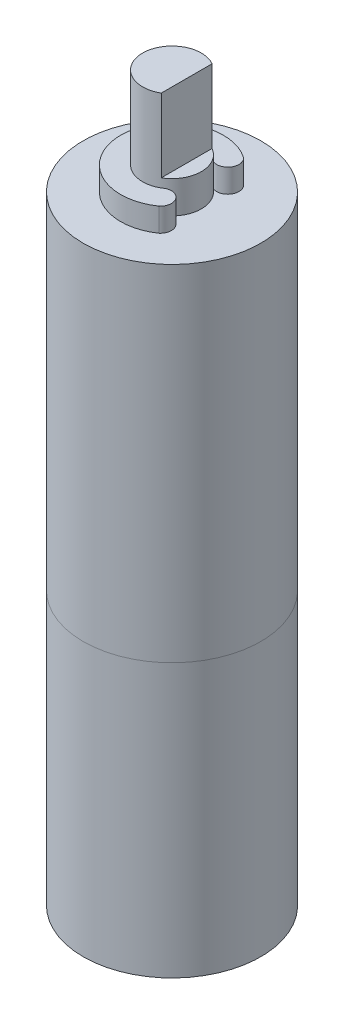
ISO-10303-21;
HEADER;
FILE_DESCRIPTION(('STEP AP214'),'2;1');
FILE_NAME('part.step','',(''),(''),'','','');
FILE_SCHEMA(('AUTOMOTIVE_DESIGN { 1 0 10303 214 1 1 1 1 }'));
ENDSEC;
DATA;
#1=APPLICATION_CONTEXT('core data for automotive mechanical design processes');
#2=APPLICATION_PROTOCOL_DEFINITION('international standard','automotive_design',2000,#1);
#3=PRODUCT_CONTEXT('',#1,'mechanical');
#4=PRODUCT('Part','Part','',(#3));
#5=PRODUCT_RELATED_PRODUCT_CATEGORY('part','',(#4));
#6=PRODUCT_DEFINITION_FORMATION('','',#4);
#7=PRODUCT_DEFINITION_CONTEXT('part definition',#1,'design');
#8=PRODUCT_DEFINITION('design','',#6,#7);
#9=PRODUCT_DEFINITION_SHAPE('','',#8);
#10=(LENGTH_UNIT() NAMED_UNIT(*) SI_UNIT(.MILLI.,.METRE.));
#11=(NAMED_UNIT(*) PLANE_ANGLE_UNIT() SI_UNIT($,.RADIAN.));
#12=(NAMED_UNIT(*) SI_UNIT($,.STERADIAN.) SOLID_ANGLE_UNIT());
#13=UNCERTAINTY_MEASURE_WITH_UNIT(LENGTH_MEASURE(1.E-05),#10,'distance_accuracy_value','');
#14=(GEOMETRIC_REPRESENTATION_CONTEXT(3) GLOBAL_UNCERTAINTY_ASSIGNED_CONTEXT((#13)) GLOBAL_UNIT_ASSIGNED_CONTEXT((#10,
#11,#12)) REPRESENTATION_CONTEXT('',''));
#15=CARTESIAN_POINT('',(0.,0.,0.));
#16=DIRECTION('',(0.,0.,1.));
#17=DIRECTION('',(1.,0.,0.));
#18=AXIS2_PLACEMENT_3D('',#15,#16,#17);
#19=CARTESIAN_POINT('',(0.,21.05,0.));
#20=DIRECTION('',(0.,1.,0.));
#21=DIRECTION('',(0.,0.,1.));
#22=AXIS2_PLACEMENT_3D('',#19,#20,#21);
#23=PLANE('',#22);
#24=CARTESIAN_POINT('',(0.,21.05,0.));
#25=DIRECTION('',(0.,1.,0.));
#26=DIRECTION('',(0.,0.,1.));
#27=AXIS2_PLACEMENT_3D('',#24,#25,#26);
#28=CIRCLE('',#27,3.025);
#29=CARTESIAN_POINT('',(0.,21.05,3.025));
#30=VERTEX_POINT('',#29);
#31=EDGE_CURVE('E12',#30,#30,#28,.T.);
#32=ORIENTED_EDGE('',*,*,#31,.T.);
#33=EDGE_LOOP('',(#32));
#34=FACE_BOUND('',#33,.T.);
#35=CARTESIAN_POINT('',(0.750070640038731,21.05,-1.15103384014043));
#36=DIRECTION('',(0.,1.,0.));
#37=DIRECTION('',(0.,0.,1.));
#38=AXIS2_PLACEMENT_3D('',#35,#36,#37);
#39=CIRCLE('',#38,0.37916372954631);
#40=CARTESIAN_POINT('',(1.00014128007746,21.05,-1.43604227649642));
#41=VERTEX_POINT('',#40);
#42=CARTESIAN_POINT('',(0.590331187613706,21.05,-0.807161129472048));
#43=VERTEX_POINT('',#42);
#44=EDGE_CURVE('E133',#41,#43,#39,.F.);
#45=ORIENTED_EDGE('',*,*,#44,.T.);
#46=CARTESIAN_POINT('',(0.,21.05,0.));
#47=DIRECTION('',(0.,1.,0.));
#48=DIRECTION('',(0.,0.,1.));
#49=AXIS2_PLACEMENT_3D('',#46,#47,#48);
#50=CIRCLE('',#49,1.);
#51=CARTESIAN_POINT('',(0.590331187613706,21.05,0.807161129472048));
#52=VERTEX_POINT('',#51);
#53=EDGE_CURVE('E123',#52,#43,#50,.T.);
#54=ORIENTED_EDGE('',*,*,#53,.F.);
#55=CARTESIAN_POINT('',(0.750070640038731,21.05,1.15103384014043));
#56=DIRECTION('',(0.,1.,0.));
#57=DIRECTION('',(0.,0.,1.));
#58=AXIS2_PLACEMENT_3D('',#55,#56,#57);
#59=CIRCLE('',#58,0.37916372954631);
#60=CARTESIAN_POINT('',(1.00014128007746,21.05,1.43604227649642));
#61=VERTEX_POINT('',#60);
#62=EDGE_CURVE('E144',#61,#52,#59,.T.);
#63=ORIENTED_EDGE('',*,*,#62,.F.);
#64=CARTESIAN_POINT('',(0.,21.05,0.));
#65=DIRECTION('',(0.,1.,0.));
#66=DIRECTION('',(0.,0.,1.));
#67=AXIS2_PLACEMENT_3D('',#64,#65,#66);
#68=CIRCLE('',#67,1.75);
#69=EDGE_CURVE('E136',#41,#61,#68,.T.);
#70=ORIENTED_EDGE('',*,*,#69,.F.);
#71=EDGE_LOOP('',(#45,#54,#63,#70));
#72=FACE_BOUND('',#71,.T.);
#73=ADVANCED_FACE('F53',(#34,#72),#23,.T.);
#74=CARTESIAN_POINT('',(0.,21.05,0.));
#75=DIRECTION('',(0.,-1.,0.));
#76=DIRECTION('',(0.,0.,-1.));
#77=AXIS2_PLACEMENT_3D('',#74,#75,#76);
#78=CYLINDRICAL_SURFACE('',#77,3.025);
#79=ORIENTED_EDGE('',*,*,#31,.F.);
#80=EDGE_LOOP('',(#79));
#81=FACE_BOUND('',#80,.T.);
#82=CARTESIAN_POINT('',(0.,9.3,0.));
#83=DIRECTION('',(0.,1.,0.));
#84=DIRECTION('',(0.,0.,1.));
#85=AXIS2_PLACEMENT_3D('',#82,#83,#84);
#86=CIRCLE('',#85,3.025);
#87=CARTESIAN_POINT('',(0.,9.3,3.025));
#88=VERTEX_POINT('',#87);
#89=EDGE_CURVE('E57',#88,#88,#86,.T.);
#90=ORIENTED_EDGE('',*,*,#89,.T.);
#91=EDGE_LOOP('',(#90));
#92=FACE_BOUND('',#91,.T.);
#93=ADVANCED_FACE('F55',(#81,#92),#78,.T.);
#94=CARTESIAN_POINT('',(0.,9.3,0.));
#95=DIRECTION('',(0.,1.,0.));
#96=DIRECTION('',(0.,0.,1.));
#97=AXIS2_PLACEMENT_3D('',#94,#95,#96);
#98=PLANE('',#97);
#99=ORIENTED_EDGE('',*,*,#89,.F.);
#100=EDGE_LOOP('',(#99));
#101=FACE_BOUND('',#100,.T.);
#102=ADVANCED_FACE('F163',(#101),#98,.F.);
#103=CARTESIAN_POINT('',(0.750070640038731,21.85,-1.15103384014043));
#104=DIRECTION('',(0.,-1.,0.));
#105=DIRECTION('',(0.,0.,-1.));
#106=AXIS2_PLACEMENT_3D('',#103,#104,#105);
#107=CYLINDRICAL_SURFACE('',#106,0.37916372954631);
#108=ORIENTED_EDGE('',*,*,#44,.F.);
#109=DIRECTION('',(0.,-1.,0.));
#110=VECTOR('',#109,1.);
#111=CARTESIAN_POINT('',(1.00014128007746,21.85,-1.43604227649642));
#112=LINE('',#111,#110);
#113=CARTESIAN_POINT('',(1.00014128007746,21.85,-1.43604227649642));
#114=VERTEX_POINT('',#113);
#115=EDGE_CURVE('E85',#114,#41,#112,.T.);
#116=ORIENTED_EDGE('',*,*,#115,.F.);
#117=CARTESIAN_POINT('',(0.750070640038731,21.85,-1.15103384014043));
#118=DIRECTION('',(0.,1.,0.));
#119=DIRECTION('',(0.,0.,1.));
#120=AXIS2_PLACEMENT_3D('',#117,#118,#119);
#121=CIRCLE('',#120,0.37916372954631);
#122=CARTESIAN_POINT('',(0.590331187613705,21.85,-0.807161129472048));
#123=VERTEX_POINT('',#122);
#124=EDGE_CURVE('E143',#114,#123,#121,.F.);
#125=ORIENTED_EDGE('',*,*,#124,.T.);
#126=DIRECTION('',(0.,-1.,0.));
#127=VECTOR('',#126,1.);
#128=CARTESIAN_POINT('',(0.590331187613705,21.85,-0.807161129472048));
#129=LINE('',#128,#127);
#130=EDGE_CURVE('E156',#123,#43,#129,.T.);
#131=ORIENTED_EDGE('',*,*,#130,.T.);
#132=EDGE_LOOP('',(#108,#116,#125,#131));
#133=FACE_BOUND('',#132,.T.);
#134=ADVANCED_FACE('F165',(#133),#107,.T.);
#135=CARTESIAN_POINT('',(0.,21.85,0.));
#136=DIRECTION('',(0.,-1.,0.));
#137=DIRECTION('',(0.,0.,-1.));
#138=AXIS2_PLACEMENT_3D('',#135,#136,#137);
#139=CYLINDRICAL_SURFACE('',#138,1.75);
#140=ORIENTED_EDGE('',*,*,#69,.T.);
#141=DIRECTION('',(0.,-1.,0.));
#142=VECTOR('',#141,1.);
#143=CARTESIAN_POINT('',(1.00014128007746,21.85,1.43604227649642));
#144=LINE('',#143,#142);
#145=CARTESIAN_POINT('',(1.00014128007746,21.85,1.43604227649642));
#146=VERTEX_POINT('',#145);
#147=EDGE_CURVE('E68',#146,#61,#144,.T.);
#148=ORIENTED_EDGE('',*,*,#147,.F.);
#149=CARTESIAN_POINT('',(0.,21.85,0.));
#150=DIRECTION('',(0.,1.,0.));
#151=DIRECTION('',(0.,0.,1.));
#152=AXIS2_PLACEMENT_3D('',#149,#150,#151);
#153=CIRCLE('',#152,1.75);
#154=EDGE_CURVE('E77',#114,#146,#153,.T.);
#155=ORIENTED_EDGE('',*,*,#154,.F.);
#156=ORIENTED_EDGE('',*,*,#115,.T.);
#157=EDGE_LOOP('',(#140,#148,#155,#156));
#158=FACE_BOUND('',#157,.T.);
#159=ADVANCED_FACE('F170',(#158),#139,.T.);
#160=CARTESIAN_POINT('',(0.750070640038731,21.85,1.15103384014043));
#161=DIRECTION('',(0.,-1.,0.));
#162=DIRECTION('',(0.,0.,-1.));
#163=AXIS2_PLACEMENT_3D('',#160,#161,#162);
#164=CYLINDRICAL_SURFACE('',#163,0.37916372954631);
#165=ORIENTED_EDGE('',*,*,#62,.T.);
#166=DIRECTION('',(0.,-1.,0.));
#167=VECTOR('',#166,1.);
#168=CARTESIAN_POINT('',(0.590331187613706,21.85,0.807161129472048));
#169=LINE('',#168,#167);
#170=CARTESIAN_POINT('',(0.590331187613707,21.85,0.807161129472047));
#171=VERTEX_POINT('',#170);
#172=EDGE_CURVE('E149',#171,#52,#169,.T.);
#173=ORIENTED_EDGE('',*,*,#172,.F.);
#174=CARTESIAN_POINT('',(0.750070640038731,21.85,1.15103384014043));
#175=DIRECTION('',(0.,1.,0.));
#176=DIRECTION('',(0.,0.,1.));
#177=AXIS2_PLACEMENT_3D('',#174,#175,#176);
#178=CIRCLE('',#177,0.37916372954631);
#179=EDGE_CURVE('E148',#146,#171,#178,.T.);
#180=ORIENTED_EDGE('',*,*,#179,.F.);
#181=ORIENTED_EDGE('',*,*,#147,.T.);
#182=EDGE_LOOP('',(#165,#173,#180,#181));
#183=FACE_BOUND('',#182,.T.);
#184=ADVANCED_FACE('F182',(#183),#164,.T.);
#185=CARTESIAN_POINT('',(0.,21.85,0.));
#186=DIRECTION('',(0.,1.,0.));
#187=DIRECTION('',(0.,0.,1.));
#188=AXIS2_PLACEMENT_3D('',#185,#186,#187);
#189=PLANE('',#188);
#190=CARTESIAN_POINT('',(0.,21.85,0.));
#191=DIRECTION('',(0.,1.,0.));
#192=DIRECTION('',(0.,0.,1.));
#193=AXIS2_PLACEMENT_3D('',#190,#191,#192);
#194=CIRCLE('',#193,1.);
#195=EDGE_CURVE('E141',#123,#171,#194,.T.);
#196=ORIENTED_EDGE('',*,*,#195,.F.);
#197=ORIENTED_EDGE('',*,*,#124,.F.);
#198=ORIENTED_EDGE('',*,*,#154,.T.);
#199=ORIENTED_EDGE('',*,*,#179,.T.);
#200=EDGE_LOOP('',(#196,#197,#198,#199));
#201=FACE_BOUND('',#200,.T.);
#202=ADVANCED_FACE('F185',(#201),#189,.T.);
#203=CARTESIAN_POINT('',(0.5,24.65,0.));
#204=DIRECTION('',(1.,0.,0.));
#205=DIRECTION('',(0.,0.,-1.));
#206=AXIS2_PLACEMENT_3D('',#203,#204,#205);
#207=PLANE('',#206);
#208=DIRECTION('',(0.,0.,1.));
#209=VECTOR('',#208,1.);
#210=CARTESIAN_POINT('',(0.5,22.15,0.));
#211=LINE('',#210,#209);
#212=CARTESIAN_POINT('',(0.5,22.15,-0.866025403784439));
#213=VERTEX_POINT('',#212);
#214=CARTESIAN_POINT('',(0.5,22.15,0.866025403784439));
#215=VERTEX_POINT('',#214);
#216=EDGE_CURVE('E119',#213,#215,#211,.T.);
#217=ORIENTED_EDGE('',*,*,#216,.F.);
#218=DIRECTION('',(0.,-1.,0.));
#219=VECTOR('',#218,1.);
#220=CARTESIAN_POINT('',(0.5,24.65,-0.866025403784439));
#221=LINE('',#220,#219);
#222=CARTESIAN_POINT('',(0.5,24.65,-0.866025403784439));
#223=VERTEX_POINT('',#222);
#224=EDGE_CURVE('E128',#223,#213,#221,.T.);
#225=ORIENTED_EDGE('',*,*,#224,.F.);
#226=DIRECTION('',(0.,0.,1.));
#227=VECTOR('',#226,1.);
#228=CARTESIAN_POINT('',(0.5,24.65,0.));
#229=LINE('',#228,#227);
#230=CARTESIAN_POINT('',(0.5,24.65,0.866025403784439));
#231=VERTEX_POINT('',#230);
#232=EDGE_CURVE('E130',#223,#231,#229,.T.);
#233=ORIENTED_EDGE('',*,*,#232,.T.);
#234=DIRECTION('',(0.,-1.,0.));
#235=VECTOR('',#234,1.);
#236=CARTESIAN_POINT('',(0.5,24.65,0.866025403784439));
#237=LINE('',#236,#235);
#238=EDGE_CURVE('E129',#231,#215,#237,.T.);
#239=ORIENTED_EDGE('',*,*,#238,.T.);
#240=EDGE_LOOP('',(#217,#225,#233,#239));
#241=FACE_BOUND('',#240,.T.);
#242=ADVANCED_FACE('F126',(#241),#207,.T.);
#243=CARTESIAN_POINT('',(0.,24.65,0.));
#244=DIRECTION('',(0.,-1.,0.));
#245=DIRECTION('',(0.,0.,-1.));
#246=AXIS2_PLACEMENT_3D('',#243,#244,#245);
#247=CYLINDRICAL_SURFACE('',#246,1.);
#248=ORIENTED_EDGE('',*,*,#195,.T.);
#249=ORIENTED_EDGE('',*,*,#172,.T.);
#250=ORIENTED_EDGE('',*,*,#53,.T.);
#251=ORIENTED_EDGE('',*,*,#130,.F.);
#252=EDGE_LOOP('',(#248,#249,#250,#251));
#253=FACE_BOUND('',#252,.T.);
#254=CARTESIAN_POINT('',(0.,22.15,0.));
#255=DIRECTION('',(0.,1.,0.));
#256=DIRECTION('',(0.,0.,1.));
#257=AXIS2_PLACEMENT_3D('',#254,#255,#256);
#258=CIRCLE('',#257,1.);
#259=EDGE_CURVE('E116',#215,#213,#258,.T.);
#260=ORIENTED_EDGE('',*,*,#259,.F.);
#261=ORIENTED_EDGE('',*,*,#238,.F.);
#262=CARTESIAN_POINT('',(0.,24.65,0.));
#263=DIRECTION('',(0.,1.,0.));
#264=DIRECTION('',(0.,0.,1.));
#265=AXIS2_PLACEMENT_3D('',#262,#263,#264);
#266=CIRCLE('',#265,1.);
#267=EDGE_CURVE('E92',#223,#231,#266,.T.);
#268=ORIENTED_EDGE('',*,*,#267,.F.);
#269=ORIENTED_EDGE('',*,*,#224,.T.);
#270=EDGE_LOOP('',(#260,#261,#268,#269));
#271=FACE_BOUND('',#270,.T.);
#272=ADVANCED_FACE('F132',(#253,#271),#247,.T.);
#273=CARTESIAN_POINT('',(0.,24.65,0.));
#274=DIRECTION('',(0.,1.,0.));
#275=DIRECTION('',(0.,0.,1.));
#276=AXIS2_PLACEMENT_3D('',#273,#274,#275);
#277=PLANE('',#276);
#278=ORIENTED_EDGE('',*,*,#232,.F.);
#279=ORIENTED_EDGE('',*,*,#267,.T.);
#280=EDGE_LOOP('',(#278,#279));
#281=FACE_BOUND('',#280,.T.);
#282=ADVANCED_FACE('F192',(#281),#277,.T.);
#283=CARTESIAN_POINT('',(0.,22.15,0.));
#284=DIRECTION('',(0.,1.,0.));
#285=DIRECTION('',(0.,0.,1.));
#286=AXIS2_PLACEMENT_3D('',#283,#284,#285);
#287=PLANE('',#286);
#288=ORIENTED_EDGE('',*,*,#259,.T.);
#289=ORIENTED_EDGE('',*,*,#216,.T.);
#290=EDGE_LOOP('',(#288,#289));
#291=FACE_BOUND('',#290,.T.);
#292=ADVANCED_FACE('F118',(#291),#287,.T.);
#293=CLOSED_SHELL('',(#73,#93,#102,#134,#159,#184,#202,#242,#272,#282,#292));
#294=MANIFOLD_SOLID_BREP('B2',#293);
#295=CARTESIAN_POINT('',(0.,9.3,0.));
#296=DIRECTION('',(0.,-1.,0.));
#297=DIRECTION('',(0.,0.,-1.));
#298=AXIS2_PLACEMENT_3D('',#295,#296,#297);
#299=CYLINDRICAL_SURFACE('',#298,3.025);
#300=CARTESIAN_POINT('',(0.,9.3,0.));
#301=DIRECTION('',(0.,1.,0.));
#302=DIRECTION('',(0.,0.,1.));
#303=AXIS2_PLACEMENT_3D('',#300,#301,#302);
#304=CIRCLE('',#303,3.025);
#305=CARTESIAN_POINT('',(0.,9.3,3.025));
#306=VERTEX_POINT('',#305);
#307=EDGE_CURVE('E52',#306,#306,#304,.T.);
#308=ORIENTED_EDGE('',*,*,#307,.F.);
#309=EDGE_LOOP('',(#308));
#310=FACE_BOUND('',#309,.T.);
#311=CARTESIAN_POINT('',(0.,0.,0.));
#312=DIRECTION('',(0.,1.,0.));
#313=DIRECTION('',(0.,0.,1.));
#314=AXIS2_PLACEMENT_3D('',#311,#312,#313);
#315=CIRCLE('',#314,3.025);
#316=CARTESIAN_POINT('',(0.,0.,3.025));
#317=VERTEX_POINT('',#316);
#318=EDGE_CURVE('E285',#317,#317,#315,.T.);
#319=ORIENTED_EDGE('',*,*,#318,.T.);
#320=EDGE_LOOP('',(#319));
#321=FACE_BOUND('',#320,.T.);
#322=ADVANCED_FACE('F282',(#310,#321),#299,.T.);
#323=CARTESIAN_POINT('',(0.,9.3,0.));
#324=DIRECTION('',(0.,1.,0.));
#325=DIRECTION('',(0.,0.,1.));
#326=AXIS2_PLACEMENT_3D('',#323,#324,#325);
#327=PLANE('',#326);
#328=ORIENTED_EDGE('',*,*,#307,.T.);
#329=EDGE_LOOP('',(#328));
#330=FACE_BOUND('',#329,.T.);
#331=ADVANCED_FACE('F297',(#330),#327,.T.);
#332=CARTESIAN_POINT('',(0.,0.,0.));
#333=DIRECTION('',(0.,1.,0.));
#334=DIRECTION('',(0.,0.,1.));
#335=AXIS2_PLACEMENT_3D('',#332,#333,#334);
#336=PLANE('',#335);
#337=ORIENTED_EDGE('',*,*,#318,.F.);
#338=EDGE_LOOP('',(#337));
#339=FACE_BOUND('',#338,.T.);
#340=ADVANCED_FACE('F295',(#339),#336,.F.);
#341=CLOSED_SHELL('',(#322,#331,#340));
#342=MANIFOLD_SOLID_BREP('B6',#341);
#343=ADVANCED_BREP_SHAPE_REPRESENTATION('',(#18,#294,#342),#14);
#344=SHAPE_DEFINITION_REPRESENTATION(#9,#343);
ENDSEC;
END-ISO-10303-21;
